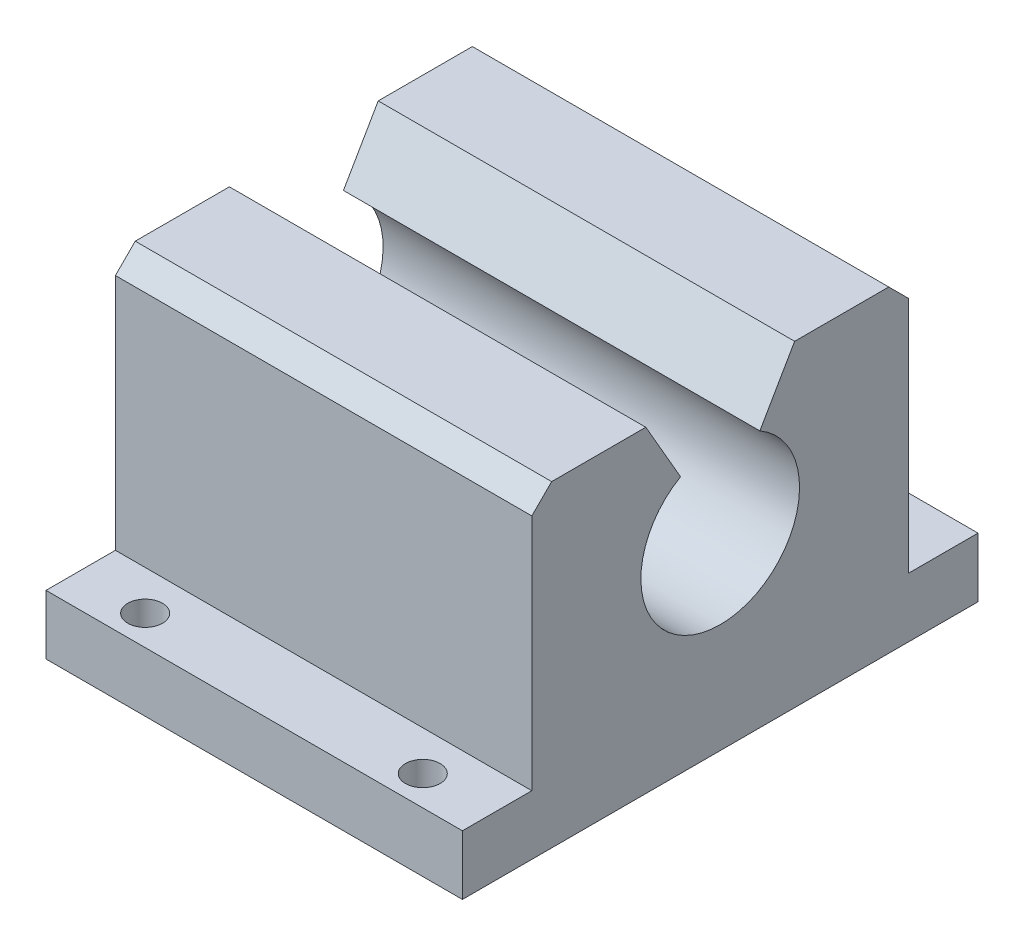
ISO-10303-21;
HEADER;
FILE_DESCRIPTION(('STEP AP214'),'2;1');
FILE_NAME('part.step','',(''),(''),'','','');
FILE_SCHEMA(('AUTOMOTIVE_DESIGN { 1 0 10303 214 1 1 1 1 }'));
ENDSEC;
DATA;
#1=APPLICATION_CONTEXT('core data for automotive mechanical design processes');
#2=APPLICATION_PROTOCOL_DEFINITION('international standard','automotive_design',2000,#1);
#3=PRODUCT_CONTEXT('',#1,'mechanical');
#4=PRODUCT('Part','Part','',(#3));
#5=PRODUCT_RELATED_PRODUCT_CATEGORY('part','',(#4));
#6=PRODUCT_DEFINITION_FORMATION('','',#4);
#7=PRODUCT_DEFINITION_CONTEXT('part definition',#1,'design');
#8=PRODUCT_DEFINITION('design','',#6,#7);
#9=PRODUCT_DEFINITION_SHAPE('','',#8);
#10=(LENGTH_UNIT() NAMED_UNIT(*) SI_UNIT(.MILLI.,.METRE.));
#11=(NAMED_UNIT(*) PLANE_ANGLE_UNIT() SI_UNIT($,.RADIAN.));
#12=(NAMED_UNIT(*) SI_UNIT($,.STERADIAN.) SOLID_ANGLE_UNIT());
#13=UNCERTAINTY_MEASURE_WITH_UNIT(LENGTH_MEASURE(1.E-05),#10,'distance_accuracy_value','');
#14=(GEOMETRIC_REPRESENTATION_CONTEXT(3) GLOBAL_UNCERTAINTY_ASSIGNED_CONTEXT((#13)) GLOBAL_UNIT_ASSIGNED_CONTEXT((#10,
#11,#12)) REPRESENTATION_CONTEXT('',''));
#15=CARTESIAN_POINT('',(0.,0.,0.));
#16=DIRECTION('',(0.,0.,1.));
#17=DIRECTION('',(1.,0.,0.));
#18=AXIS2_PLACEMENT_3D('',#15,#16,#17);
#19=CARTESIAN_POINT('',(66.675,50.8,30.1625));
#20=DIRECTION('',(0.,1.,0.));
#21=DIRECTION('',(0.,0.,1.));
#22=AXIS2_PLACEMENT_3D('',#19,#20,#21);
#23=PLANE('',#22);
#24=DIRECTION('',(0.,0.,-1.));
#25=VECTOR('',#24,1.);
#26=CARTESIAN_POINT('',(66.675,50.8,30.1625));
#27=LINE('',#26,#25);
#28=CARTESIAN_POINT('',(66.675,50.8,-11.9150661804009));
#29=VERTEX_POINT('',#28);
#30=CARTESIAN_POINT('',(66.675,50.8,-26.9874999999999));
#31=VERTEX_POINT('',#30);
#32=EDGE_CURVE('E273',#29,#31,#27,.T.);
#33=ORIENTED_EDGE('',*,*,#32,.T.);
#34=DIRECTION('',(-1.,0.,0.));
#35=VECTOR('',#34,1.);
#36=CARTESIAN_POINT('',(0.,50.8,-26.9874999999999));
#37=LINE('',#36,#35);
#38=CARTESIAN_POINT('',(0.,50.8,-26.9874999999999));
#39=VERTEX_POINT('',#38);
#40=EDGE_CURVE('E42',#31,#39,#37,.T.);
#41=ORIENTED_EDGE('',*,*,#40,.T.);
#42=DIRECTION('',(0.,0.,-1.));
#43=VECTOR('',#42,1.);
#44=CARTESIAN_POINT('',(0.,50.8,30.1625));
#45=LINE('',#44,#43);
#46=CARTESIAN_POINT('',(0.,50.8,-11.9150661804009));
#47=VERTEX_POINT('',#46);
#48=EDGE_CURVE('E151',#47,#39,#45,.T.);
#49=ORIENTED_EDGE('',*,*,#48,.F.);
#50=DIRECTION('',(1.,0.,0.));
#51=VECTOR('',#50,1.);
#52=CARTESIAN_POINT('',(0.,50.8,-11.9150661804009));
#53=LINE('',#52,#51);
#54=EDGE_CURVE('E135',#47,#29,#53,.T.);
#55=ORIENTED_EDGE('',*,*,#54,.T.);
#56=EDGE_LOOP('',(#33,#41,#49,#55));
#57=FACE_BOUND('',#56,.T.);
#58=ADVANCED_FACE('F34',(#57),#23,.T.);
#59=CARTESIAN_POINT('',(66.675,50.8,-41.275));
#60=DIRECTION('',(-1.,0.,0.));
#61=DIRECTION('',(0.,0.,1.));
#62=AXIS2_PLACEMENT_3D('',#59,#60,#61);
#63=PLANE('',#62);
#64=CARTESIAN_POINT('',(66.675,50.8,26.9875));
#65=VERTEX_POINT('',#64);
#66=CARTESIAN_POINT('',(66.675,50.8,11.9150661804009));
#67=VERTEX_POINT('',#66);
#68=EDGE_CURVE('E217',#65,#67,#27,.T.);
#69=ORIENTED_EDGE('',*,*,#68,.F.);
#70=DIRECTION('',(0.,0.707106781186551,-0.707106781186544));
#71=VECTOR('',#70,1.);
#72=CARTESIAN_POINT('',(66.675,47.6249999999999,30.1625));
#73=LINE('',#72,#71);
#74=CARTESIAN_POINT('',(66.675,47.6249999999999,30.1625));
#75=VERTEX_POINT('',#74);
#76=EDGE_CURVE('E207',#65,#75,#73,.F.);
#77=ORIENTED_EDGE('',*,*,#76,.T.);
#78=DIRECTION('',(0.,1.,0.));
#79=VECTOR('',#78,1.);
#80=CARTESIAN_POINT('',(66.675,9.525,30.1625));
#81=LINE('',#80,#79);
#82=CARTESIAN_POINT('',(66.675,9.525,30.1625));
#83=VERTEX_POINT('',#82);
#84=EDGE_CURVE('E214',#83,#75,#81,.T.);
#85=ORIENTED_EDGE('',*,*,#84,.F.);
#86=DIRECTION('',(0.,0.,-1.));
#87=VECTOR('',#86,1.);
#88=CARTESIAN_POINT('',(66.675,9.525,41.275));
#89=LINE('',#88,#87);
#90=CARTESIAN_POINT('',(66.675,9.525,41.275));
#91=VERTEX_POINT('',#90);
#92=EDGE_CURVE('E224',#91,#83,#89,.T.);
#93=ORIENTED_EDGE('',*,*,#92,.F.);
#94=DIRECTION('',(0.,1.,0.));
#95=VECTOR('',#94,1.);
#96=CARTESIAN_POINT('',(66.675,0.,41.275));
#97=LINE('',#96,#95);
#98=CARTESIAN_POINT('',(66.675,0.,41.275));
#99=VERTEX_POINT('',#98);
#100=EDGE_CURVE('E276',#99,#91,#97,.T.);
#101=ORIENTED_EDGE('',*,*,#100,.F.);
#102=DIRECTION('',(0.,0.,-1.));
#103=VECTOR('',#102,1.);
#104=CARTESIAN_POINT('',(66.675,0.,41.275));
#105=LINE('',#104,#103);
#106=CARTESIAN_POINT('',(66.675,0.,-41.275));
#107=VERTEX_POINT('',#106);
#108=EDGE_CURVE('E181',#99,#107,#105,.T.);
#109=ORIENTED_EDGE('',*,*,#108,.T.);
#110=DIRECTION('',(0.,1.,0.));
#111=VECTOR('',#110,1.);
#112=CARTESIAN_POINT('',(66.675,0.,-41.275));
#113=LINE('',#112,#111);
#114=CARTESIAN_POINT('',(66.675,9.525,-41.275));
#115=VERTEX_POINT('',#114);
#116=EDGE_CURVE('E176',#107,#115,#113,.T.);
#117=ORIENTED_EDGE('',*,*,#116,.T.);
#118=DIRECTION('',(0.,0.,1.));
#119=VECTOR('',#118,1.);
#120=CARTESIAN_POINT('',(66.675,9.525,-41.275));
#121=LINE('',#120,#119);
#122=CARTESIAN_POINT('',(66.675,9.525,-30.1625));
#123=VERTEX_POINT('',#122);
#124=EDGE_CURVE('E269',#115,#123,#121,.T.);
#125=ORIENTED_EDGE('',*,*,#124,.T.);
#126=DIRECTION('',(0.,1.,0.));
#127=VECTOR('',#126,1.);
#128=CARTESIAN_POINT('',(66.675,9.525,-30.1625));
#129=LINE('',#128,#127);
#130=CARTESIAN_POINT('',(66.675,47.625,-30.1625));
#131=VERTEX_POINT('',#130);
#132=EDGE_CURVE('E271',#123,#131,#129,.T.);
#133=ORIENTED_EDGE('',*,*,#132,.T.);
#134=DIRECTION('',(0.,0.707106781186545,0.707106781186551));
#135=VECTOR('',#134,1.);
#136=CARTESIAN_POINT('',(66.675,50.8,-26.9874999999999));
#137=LINE('',#136,#135);
#138=EDGE_CURVE('E49',#131,#31,#137,.T.);
#139=ORIENTED_EDGE('',*,*,#138,.T.);
#140=ORIENTED_EDGE('',*,*,#32,.F.);
#141=DIRECTION('',(0.,-0.866025403784438,0.500000000000001));
#142=VECTOR('',#141,1.);
#143=CARTESIAN_POINT('',(66.675,50.8,-11.9150661804009));
#144=LINE('',#143,#142);
#145=CARTESIAN_POINT('',(66.675,41.1610226280624,-6.35000000000001));
#146=VERTEX_POINT('',#145);
#147=EDGE_CURVE('E141',#29,#146,#144,.T.);
#148=ORIENTED_EDGE('',*,*,#147,.T.);
#149=CARTESIAN_POINT('',(66.675,30.1625,0.));
#150=DIRECTION('',(1.,0.,0.));
#151=DIRECTION('',(0.,0.,-1.));
#152=AXIS2_PLACEMENT_3D('',#149,#150,#151);
#153=CIRCLE('',#152,12.7);
#154=CARTESIAN_POINT('',(66.675,41.1610226280624,6.35000000000001));
#155=VERTEX_POINT('',#154);
#156=EDGE_CURVE('E262',#155,#146,#153,.T.);
#157=ORIENTED_EDGE('',*,*,#156,.F.);
#158=DIRECTION('',(0.,-0.866025403784438,-0.500000000000001));
#159=VECTOR('',#158,1.);
#160=CARTESIAN_POINT('',(66.675,50.8,11.9150661804009));
#161=LINE('',#160,#159);
#162=EDGE_CURVE('E482',#67,#155,#161,.T.);
#163=ORIENTED_EDGE('',*,*,#162,.F.);
#164=EDGE_LOOP('',(#69,#77,#85,#93,#101,#109,#117,#125,#133,#139,#140,#148,#157,#163));
#165=FACE_BOUND('',#164,.T.);
#166=ADVANCED_FACE('F212',(#165),#63,.F.);
#167=CARTESIAN_POINT('',(0.,50.8,-41.275));
#168=DIRECTION('',(-1.,0.,0.));
#169=DIRECTION('',(0.,0.,1.));
#170=AXIS2_PLACEMENT_3D('',#167,#168,#169);
#171=PLANE('',#170);
#172=DIRECTION('',(0.,1.,0.));
#173=VECTOR('',#172,1.);
#174=CARTESIAN_POINT('',(0.,9.525,30.1625));
#175=LINE('',#174,#173);
#176=CARTESIAN_POINT('',(0.,9.525,30.1625));
#177=VERTEX_POINT('',#176);
#178=CARTESIAN_POINT('',(0.,47.6249999999999,30.1625));
#179=VERTEX_POINT('',#178);
#180=EDGE_CURVE('E162',#177,#179,#175,.T.);
#181=ORIENTED_EDGE('',*,*,#180,.T.);
#182=DIRECTION('',(0.,-0.707106781186551,0.707106781186544));
#183=VECTOR('',#182,1.);
#184=CARTESIAN_POINT('',(0.,84.93125,-7.14374999999968));
#185=LINE('',#184,#183);
#186=CARTESIAN_POINT('',(0.,50.8,26.9875));
#187=VERTEX_POINT('',#186);
#188=EDGE_CURVE('E202',#179,#187,#185,.F.);
#189=ORIENTED_EDGE('',*,*,#188,.T.);
#190=CARTESIAN_POINT('',(0.,50.8,11.9150661804009));
#191=VERTEX_POINT('',#190);
#192=EDGE_CURVE('E159',#187,#191,#45,.T.);
#193=ORIENTED_EDGE('',*,*,#192,.T.);
#194=DIRECTION('',(0.,-0.866025403784438,-0.500000000000001));
#195=VECTOR('',#194,1.);
#196=CARTESIAN_POINT('',(0.,50.8,11.9150661804009));
#197=LINE('',#196,#195);
#198=CARTESIAN_POINT('',(0.,41.1610226280624,6.35000000000001));
#199=VERTEX_POINT('',#198);
#200=EDGE_CURVE('E155',#191,#199,#197,.T.);
#201=ORIENTED_EDGE('',*,*,#200,.T.);
#202=CARTESIAN_POINT('',(0.,30.1625,0.));
#203=DIRECTION('',(1.,0.,0.));
#204=DIRECTION('',(0.,0.,-1.));
#205=AXIS2_PLACEMENT_3D('',#202,#203,#204);
#206=CIRCLE('',#205,12.7);
#207=CARTESIAN_POINT('',(0.,41.1610226280624,-6.35000000000001));
#208=VERTEX_POINT('',#207);
#209=EDGE_CURVE('E154',#199,#208,#206,.T.);
#210=ORIENTED_EDGE('',*,*,#209,.T.);
#211=DIRECTION('',(0.,-0.866025403784438,0.500000000000001));
#212=VECTOR('',#211,1.);
#213=CARTESIAN_POINT('',(0.,50.8,-11.9150661804009));
#214=LINE('',#213,#212);
#215=EDGE_CURVE('E138',#47,#208,#214,.T.);
#216=ORIENTED_EDGE('',*,*,#215,.F.);
#217=ORIENTED_EDGE('',*,*,#48,.T.);
#218=DIRECTION('',(0.,-0.707106781186545,-0.707106781186551));
#219=VECTOR('',#218,1.);
#220=CARTESIAN_POINT('',(0.,43.65625,-34.13125));
#221=LINE('',#220,#219);
#222=CARTESIAN_POINT('',(0.,47.625,-30.1625));
#223=VERTEX_POINT('',#222);
#224=EDGE_CURVE('E200',#39,#223,#221,.T.);
#225=ORIENTED_EDGE('',*,*,#224,.T.);
#226=DIRECTION('',(0.,1.,0.));
#227=VECTOR('',#226,1.);
#228=CARTESIAN_POINT('',(0.,9.525,-30.1625));
#229=LINE('',#228,#227);
#230=CARTESIAN_POINT('',(0.,9.525,-30.1625));
#231=VERTEX_POINT('',#230);
#232=EDGE_CURVE('E160',#231,#223,#229,.T.);
#233=ORIENTED_EDGE('',*,*,#232,.F.);
#234=DIRECTION('',(0.,0.,1.));
#235=VECTOR('',#234,1.);
#236=CARTESIAN_POINT('',(0.,9.525,-41.275));
#237=LINE('',#236,#235);
#238=CARTESIAN_POINT('',(0.,9.525,-41.275));
#239=VERTEX_POINT('',#238);
#240=EDGE_CURVE('E163',#239,#231,#237,.T.);
#241=ORIENTED_EDGE('',*,*,#240,.F.);
#242=DIRECTION('',(0.,1.,0.));
#243=VECTOR('',#242,1.);
#244=CARTESIAN_POINT('',(0.,0.,-41.275));
#245=LINE('',#244,#243);
#246=CARTESIAN_POINT('',(0.,0.,-41.275));
#247=VERTEX_POINT('',#246);
#248=EDGE_CURVE('E265',#247,#239,#245,.T.);
#249=ORIENTED_EDGE('',*,*,#248,.F.);
#250=DIRECTION('',(0.,0.,-1.));
#251=VECTOR('',#250,1.);
#252=CARTESIAN_POINT('',(0.,0.,41.275));
#253=LINE('',#252,#251);
#254=CARTESIAN_POINT('',(0.,0.,41.275));
#255=VERTEX_POINT('',#254);
#256=EDGE_CURVE('E174',#255,#247,#253,.T.);
#257=ORIENTED_EDGE('',*,*,#256,.F.);
#258=DIRECTION('',(0.,1.,0.));
#259=VECTOR('',#258,1.);
#260=CARTESIAN_POINT('',(0.,0.,41.275));
#261=LINE('',#260,#259);
#262=CARTESIAN_POINT('',(0.,9.525,41.275));
#263=VERTEX_POINT('',#262);
#264=EDGE_CURVE('E171',#255,#263,#261,.T.);
#265=ORIENTED_EDGE('',*,*,#264,.T.);
#266=DIRECTION('',(0.,0.,-1.));
#267=VECTOR('',#266,1.);
#268=CARTESIAN_POINT('',(0.,9.525,41.275));
#269=LINE('',#268,#267);
#270=EDGE_CURVE('E168',#263,#177,#269,.T.);
#271=ORIENTED_EDGE('',*,*,#270,.T.);
#272=EDGE_LOOP('',(#181,#189,#193,#201,#210,#216,#217,#225,#233,#241,#249,#257,#265,#271));
#273=FACE_BOUND('',#272,.T.);
#274=ADVANCED_FACE('F150',(#273),#171,.T.);
#275=CARTESIAN_POINT('',(66.675,0.,-41.275));
#276=DIRECTION('',(0.,0.,1.));
#277=DIRECTION('',(1.,0.,0.));
#278=AXIS2_PLACEMENT_3D('',#275,#276,#277);
#279=PLANE('',#278);
#280=ORIENTED_EDGE('',*,*,#248,.T.);
#281=DIRECTION('',(-1.,0.,0.));
#282=VECTOR('',#281,1.);
#283=CARTESIAN_POINT('',(66.675,9.525,-41.275));
#284=LINE('',#283,#282);
#285=EDGE_CURVE('E190',#115,#239,#284,.T.);
#286=ORIENTED_EDGE('',*,*,#285,.F.);
#287=ORIENTED_EDGE('',*,*,#116,.F.);
#288=DIRECTION('',(-1.,0.,0.));
#289=VECTOR('',#288,1.);
#290=CARTESIAN_POINT('',(66.675,0.,-41.275));
#291=LINE('',#290,#289);
#292=EDGE_CURVE('E177',#107,#247,#291,.T.);
#293=ORIENTED_EDGE('',*,*,#292,.T.);
#294=EDGE_LOOP('',(#280,#286,#287,#293));
#295=FACE_BOUND('',#294,.T.);
#296=ADVANCED_FACE('F311',(#295),#279,.F.);
#297=CARTESIAN_POINT('',(66.675,9.525,-41.275));
#298=DIRECTION('',(0.,-1.,0.));
#299=DIRECTION('',(0.,0.,-1.));
#300=AXIS2_PLACEMENT_3D('',#297,#298,#299);
#301=PLANE('',#300);
#302=CARTESIAN_POINT('',(11.1125,9.525,-36.5125));
#303=DIRECTION('',(0.,1.,0.));
#304=DIRECTION('',(0.,0.,1.));
#305=AXIS2_PLACEMENT_3D('',#302,#303,#304);
#306=CIRCLE('',#305,2.778125);
#307=CARTESIAN_POINT('',(11.1125,9.525,-33.734375));
#308=VERTEX_POINT('',#307);
#309=EDGE_CURVE('E234',#308,#308,#306,.T.);
#310=ORIENTED_EDGE('',*,*,#309,.F.);
#311=EDGE_LOOP('',(#310));
#312=FACE_BOUND('',#311,.T.);
#313=CARTESIAN_POINT('',(55.5625,9.525,-36.5125));
#314=DIRECTION('',(0.,1.,0.));
#315=DIRECTION('',(0.,0.,1.));
#316=AXIS2_PLACEMENT_3D('',#313,#314,#315);
#317=CIRCLE('',#316,2.778125);
#318=CARTESIAN_POINT('',(55.5625,9.525,-33.734375));
#319=VERTEX_POINT('',#318);
#320=EDGE_CURVE('E248',#319,#319,#317,.T.);
#321=ORIENTED_EDGE('',*,*,#320,.F.);
#322=EDGE_LOOP('',(#321));
#323=FACE_BOUND('',#322,.T.);
#324=ORIENTED_EDGE('',*,*,#240,.T.);
#325=DIRECTION('',(-1.,0.,0.));
#326=VECTOR('',#325,1.);
#327=CARTESIAN_POINT('',(66.675,9.525,-30.1625));
#328=LINE('',#327,#326);
#329=EDGE_CURVE('E187',#123,#231,#328,.T.);
#330=ORIENTED_EDGE('',*,*,#329,.F.);
#331=ORIENTED_EDGE('',*,*,#124,.F.);
#332=ORIENTED_EDGE('',*,*,#285,.T.);
#333=EDGE_LOOP('',(#324,#330,#331,#332));
#334=FACE_BOUND('',#333,.T.);
#335=ADVANCED_FACE('F283',(#312,#323,#334),#301,.F.);
#336=CARTESIAN_POINT('',(66.675,9.525,-30.1625));
#337=DIRECTION('',(0.,0.,1.));
#338=DIRECTION('',(1.,0.,0.));
#339=AXIS2_PLACEMENT_3D('',#336,#337,#338);
#340=PLANE('',#339);
#341=ORIENTED_EDGE('',*,*,#232,.T.);
#342=DIRECTION('',(1.,0.,0.));
#343=VECTOR('',#342,1.);
#344=CARTESIAN_POINT('',(66.675,47.625,-30.1625));
#345=LINE('',#344,#343);
#346=EDGE_CURVE('E11',#223,#131,#345,.T.);
#347=ORIENTED_EDGE('',*,*,#346,.T.);
#348=ORIENTED_EDGE('',*,*,#132,.F.);
#349=ORIENTED_EDGE('',*,*,#329,.T.);
#350=EDGE_LOOP('',(#341,#347,#348,#349));
#351=FACE_BOUND('',#350,.T.);
#352=ADVANCED_FACE('F287',(#351),#340,.F.);
#353=ORIENTED_EDGE('',*,*,#192,.F.);
#354=DIRECTION('',(1.,0.,0.));
#355=VECTOR('',#354,1.);
#356=CARTESIAN_POINT('',(66.675,50.8,26.9875));
#357=LINE('',#356,#355);
#358=EDGE_CURVE('E204',#187,#65,#357,.T.);
#359=ORIENTED_EDGE('',*,*,#358,.T.);
#360=ORIENTED_EDGE('',*,*,#68,.T.);
#361=DIRECTION('',(1.,0.,0.));
#362=VECTOR('',#361,1.);
#363=CARTESIAN_POINT('',(0.,50.8,11.9150661804009));
#364=LINE('',#363,#362);
#365=EDGE_CURVE('E144',#191,#67,#364,.T.);
#366=ORIENTED_EDGE('',*,*,#365,.F.);
#367=EDGE_LOOP('',(#353,#359,#360,#366));
#368=FACE_BOUND('',#367,.T.);
#369=ADVANCED_FACE('F231',(#368),#23,.T.);
#370=CARTESIAN_POINT('',(66.675,9.525,30.1625));
#371=DIRECTION('',(0.,0.,1.));
#372=DIRECTION('',(1.,0.,0.));
#373=AXIS2_PLACEMENT_3D('',#370,#371,#372);
#374=PLANE('',#373);
#375=ORIENTED_EDGE('',*,*,#84,.T.);
#376=DIRECTION('',(-1.,0.,0.));
#377=VECTOR('',#376,1.);
#378=CARTESIAN_POINT('',(66.675,47.6249999999999,30.1625));
#379=LINE('',#378,#377);
#380=EDGE_CURVE('E197',#75,#179,#379,.T.);
#381=ORIENTED_EDGE('',*,*,#380,.T.);
#382=ORIENTED_EDGE('',*,*,#180,.F.);
#383=DIRECTION('',(-1.,0.,0.));
#384=VECTOR('',#383,1.);
#385=CARTESIAN_POINT('',(66.675,9.525,30.1625));
#386=LINE('',#385,#384);
#387=EDGE_CURVE('E185',#83,#177,#386,.T.);
#388=ORIENTED_EDGE('',*,*,#387,.F.);
#389=EDGE_LOOP('',(#375,#381,#382,#388));
#390=FACE_BOUND('',#389,.T.);
#391=ADVANCED_FACE('F222',(#390),#374,.T.);
#392=CARTESIAN_POINT('',(66.675,9.525,41.275));
#393=DIRECTION('',(0.,1.,0.));
#394=DIRECTION('',(0.,0.,1.));
#395=AXIS2_PLACEMENT_3D('',#392,#393,#394);
#396=PLANE('',#395);
#397=CARTESIAN_POINT('',(11.1125,9.525,36.5125));
#398=DIRECTION('',(0.,1.,0.));
#399=DIRECTION('',(0.,0.,1.));
#400=AXIS2_PLACEMENT_3D('',#397,#398,#399);
#401=CIRCLE('',#400,2.778125);
#402=CARTESIAN_POINT('',(11.1125,9.525,39.290625));
#403=VERTEX_POINT('',#402);
#404=EDGE_CURVE('E243',#403,#403,#401,.T.);
#405=ORIENTED_EDGE('',*,*,#404,.F.);
#406=EDGE_LOOP('',(#405));
#407=FACE_BOUND('',#406,.T.);
#408=CARTESIAN_POINT('',(55.5625,9.525,36.5125));
#409=DIRECTION('',(0.,1.,0.));
#410=DIRECTION('',(0.,0.,1.));
#411=AXIS2_PLACEMENT_3D('',#408,#409,#410);
#412=CIRCLE('',#411,2.778125);
#413=CARTESIAN_POINT('',(55.5625,9.525,39.290625));
#414=VERTEX_POINT('',#413);
#415=EDGE_CURVE('E254',#414,#414,#412,.T.);
#416=ORIENTED_EDGE('',*,*,#415,.F.);
#417=EDGE_LOOP('',(#416));
#418=FACE_BOUND('',#417,.T.);
#419=ORIENTED_EDGE('',*,*,#270,.F.);
#420=DIRECTION('',(-1.,0.,0.));
#421=VECTOR('',#420,1.);
#422=CARTESIAN_POINT('',(66.675,9.525,41.275));
#423=LINE('',#422,#421);
#424=EDGE_CURVE('E183',#91,#263,#423,.T.);
#425=ORIENTED_EDGE('',*,*,#424,.F.);
#426=ORIENTED_EDGE('',*,*,#92,.T.);
#427=ORIENTED_EDGE('',*,*,#387,.T.);
#428=EDGE_LOOP('',(#419,#425,#426,#427));
#429=FACE_BOUND('',#428,.T.);
#430=ADVANCED_FACE('F307',(#407,#418,#429),#396,.T.);
#431=CARTESIAN_POINT('',(66.675,0.,41.275));
#432=DIRECTION('',(0.,0.,1.));
#433=DIRECTION('',(1.,0.,0.));
#434=AXIS2_PLACEMENT_3D('',#431,#432,#433);
#435=PLANE('',#434);
#436=ORIENTED_EDGE('',*,*,#264,.F.);
#437=DIRECTION('',(-1.,0.,0.));
#438=VECTOR('',#437,1.);
#439=CARTESIAN_POINT('',(66.675,0.,41.275));
#440=LINE('',#439,#438);
#441=EDGE_CURVE('E180',#99,#255,#440,.T.);
#442=ORIENTED_EDGE('',*,*,#441,.F.);
#443=ORIENTED_EDGE('',*,*,#100,.T.);
#444=ORIENTED_EDGE('',*,*,#424,.T.);
#445=EDGE_LOOP('',(#436,#442,#443,#444));
#446=FACE_BOUND('',#445,.T.);
#447=ADVANCED_FACE('F327',(#446),#435,.T.);
#448=CARTESIAN_POINT('',(66.675,0.,41.275));
#449=DIRECTION('',(0.,1.,0.));
#450=DIRECTION('',(0.,0.,1.));
#451=AXIS2_PLACEMENT_3D('',#448,#449,#450);
#452=PLANE('',#451);
#453=CARTESIAN_POINT('',(11.1125,0.,-36.5125));
#454=DIRECTION('',(0.,1.,0.));
#455=DIRECTION('',(0.,0.,1.));
#456=AXIS2_PLACEMENT_3D('',#453,#454,#455);
#457=CIRCLE('',#456,2.778125);
#458=CARTESIAN_POINT('',(11.1125,0.,-33.734375));
#459=VERTEX_POINT('',#458);
#460=EDGE_CURVE('E237',#459,#459,#457,.T.);
#461=ORIENTED_EDGE('',*,*,#460,.T.);
#462=EDGE_LOOP('',(#461));
#463=FACE_BOUND('',#462,.T.);
#464=CARTESIAN_POINT('',(11.1125,0.,36.5125));
#465=DIRECTION('',(0.,1.,0.));
#466=DIRECTION('',(0.,0.,1.));
#467=AXIS2_PLACEMENT_3D('',#464,#465,#466);
#468=CIRCLE('',#467,2.778125);
#469=CARTESIAN_POINT('',(11.1125,0.,39.290625));
#470=VERTEX_POINT('',#469);
#471=EDGE_CURVE('E245',#470,#470,#468,.T.);
#472=ORIENTED_EDGE('',*,*,#471,.T.);
#473=EDGE_LOOP('',(#472));
#474=FACE_BOUND('',#473,.T.);
#475=CARTESIAN_POINT('',(55.5625,0.,-36.5125));
#476=DIRECTION('',(0.,1.,0.));
#477=DIRECTION('',(0.,0.,1.));
#478=AXIS2_PLACEMENT_3D('',#475,#476,#477);
#479=CIRCLE('',#478,2.778125);
#480=CARTESIAN_POINT('',(55.5625,0.,-33.734375));
#481=VERTEX_POINT('',#480);
#482=EDGE_CURVE('E251',#481,#481,#479,.T.);
#483=ORIENTED_EDGE('',*,*,#482,.T.);
#484=EDGE_LOOP('',(#483));
#485=FACE_BOUND('',#484,.T.);
#486=CARTESIAN_POINT('',(55.5625,0.,36.5125));
#487=DIRECTION('',(0.,1.,0.));
#488=DIRECTION('',(0.,0.,1.));
#489=AXIS2_PLACEMENT_3D('',#486,#487,#488);
#490=CIRCLE('',#489,2.778125);
#491=CARTESIAN_POINT('',(55.5625,0.,39.290625));
#492=VERTEX_POINT('',#491);
#493=EDGE_CURVE('E257',#492,#492,#490,.T.);
#494=ORIENTED_EDGE('',*,*,#493,.T.);
#495=EDGE_LOOP('',(#494));
#496=FACE_BOUND('',#495,.T.);
#497=ORIENTED_EDGE('',*,*,#256,.T.);
#498=ORIENTED_EDGE('',*,*,#292,.F.);
#499=ORIENTED_EDGE('',*,*,#108,.F.);
#500=ORIENTED_EDGE('',*,*,#441,.T.);
#501=EDGE_LOOP('',(#497,#498,#499,#500));
#502=FACE_BOUND('',#501,.T.);
#503=ADVANCED_FACE('F332',(#463,#474,#485,#496,#502),#452,.F.);
#504=CARTESIAN_POINT('',(66.675,30.1625,0.));
#505=DIRECTION('',(-1.,0.,0.));
#506=DIRECTION('',(0.,0.,1.));
#507=AXIS2_PLACEMENT_3D('',#504,#505,#506);
#508=CYLINDRICAL_SURFACE('',#507,12.7);
#509=DIRECTION('',(-1.,0.,0.));
#510=VECTOR('',#509,1.);
#511=CARTESIAN_POINT('',(66.675,41.1610226280624,6.35000000000001));
#512=LINE('',#511,#510);
#513=EDGE_CURVE('E195',#155,#199,#512,.T.);
#514=ORIENTED_EDGE('',*,*,#513,.F.);
#515=ORIENTED_EDGE('',*,*,#156,.T.);
#516=DIRECTION('',(-1.,0.,0.));
#517=VECTOR('',#516,1.);
#518=CARTESIAN_POINT('',(66.675,41.1610226280624,-6.35000000000001));
#519=LINE('',#518,#517);
#520=EDGE_CURVE('E193',#146,#208,#519,.T.);
#521=ORIENTED_EDGE('',*,*,#520,.T.);
#522=ORIENTED_EDGE('',*,*,#209,.F.);
#523=EDGE_LOOP('',(#514,#515,#521,#522));
#524=FACE_BOUND('',#523,.T.);
#525=ADVANCED_FACE('F334',(#524),#508,.F.);
#526=CARTESIAN_POINT('',(55.5625,0.,36.5125));
#527=DIRECTION('',(0.,1.,0.));
#528=DIRECTION('',(0.,0.,1.));
#529=AXIS2_PLACEMENT_3D('',#526,#527,#528);
#530=CYLINDRICAL_SURFACE('',#529,2.778125);
#531=ORIENTED_EDGE('',*,*,#493,.F.);
#532=EDGE_LOOP('',(#531));
#533=FACE_BOUND('',#532,.T.);
#534=ORIENTED_EDGE('',*,*,#415,.T.);
#535=EDGE_LOOP('',(#534));
#536=FACE_BOUND('',#535,.T.);
#537=ADVANCED_FACE('F341',(#533,#536),#530,.F.);
#538=CARTESIAN_POINT('',(55.5625,0.,-36.5125));
#539=DIRECTION('',(0.,1.,0.));
#540=DIRECTION('',(0.,0.,1.));
#541=AXIS2_PLACEMENT_3D('',#538,#539,#540);
#542=CYLINDRICAL_SURFACE('',#541,2.778125);
#543=ORIENTED_EDGE('',*,*,#482,.F.);
#544=EDGE_LOOP('',(#543));
#545=FACE_BOUND('',#544,.T.);
#546=ORIENTED_EDGE('',*,*,#320,.T.);
#547=EDGE_LOOP('',(#546));
#548=FACE_BOUND('',#547,.T.);
#549=ADVANCED_FACE('F356',(#545,#548),#542,.F.);
#550=CARTESIAN_POINT('',(11.1125,0.,36.5125));
#551=DIRECTION('',(0.,1.,0.));
#552=DIRECTION('',(0.,0.,1.));
#553=AXIS2_PLACEMENT_3D('',#550,#551,#552);
#554=CYLINDRICAL_SURFACE('',#553,2.778125);
#555=ORIENTED_EDGE('',*,*,#471,.F.);
#556=EDGE_LOOP('',(#555));
#557=FACE_BOUND('',#556,.T.);
#558=ORIENTED_EDGE('',*,*,#404,.T.);
#559=EDGE_LOOP('',(#558));
#560=FACE_BOUND('',#559,.T.);
#561=ADVANCED_FACE('F362',(#557,#560),#554,.F.);
#562=CARTESIAN_POINT('',(11.1125,0.,-36.5125));
#563=DIRECTION('',(0.,1.,0.));
#564=DIRECTION('',(0.,0.,1.));
#565=AXIS2_PLACEMENT_3D('',#562,#563,#564);
#566=CYLINDRICAL_SURFACE('',#565,2.778125);
#567=ORIENTED_EDGE('',*,*,#460,.F.);
#568=EDGE_LOOP('',(#567));
#569=FACE_BOUND('',#568,.T.);
#570=ORIENTED_EDGE('',*,*,#309,.T.);
#571=EDGE_LOOP('',(#570));
#572=FACE_BOUND('',#571,.T.);
#573=ADVANCED_FACE('F369',(#569,#572),#566,.F.);
#574=CARTESIAN_POINT('',(0.,50.8,-11.9150661804009));
#575=DIRECTION('',(0.,0.500000000000001,0.866025403784438));
#576=DIRECTION('',(0.,-0.866025403784438,0.500000000000001));
#577=AXIS2_PLACEMENT_3D('',#574,#575,#576);
#578=PLANE('',#577);
#579=ORIENTED_EDGE('',*,*,#147,.F.);
#580=ORIENTED_EDGE('',*,*,#54,.F.);
#581=ORIENTED_EDGE('',*,*,#215,.T.);
#582=ORIENTED_EDGE('',*,*,#520,.F.);
#583=EDGE_LOOP('',(#579,#580,#581,#582));
#584=FACE_BOUND('',#583,.T.);
#585=ADVANCED_FACE('F137',(#584),#578,.T.);
#586=CARTESIAN_POINT('',(0.,50.8,11.9150661804009));
#587=DIRECTION('',(0.,-0.500000000000001,0.866025403784438));
#588=DIRECTION('',(0.,-0.866025403784438,-0.500000000000001));
#589=AXIS2_PLACEMENT_3D('',#586,#587,#588);
#590=PLANE('',#589);
#591=ORIENTED_EDGE('',*,*,#513,.T.);
#592=ORIENTED_EDGE('',*,*,#200,.F.);
#593=ORIENTED_EDGE('',*,*,#365,.T.);
#594=ORIENTED_EDGE('',*,*,#162,.T.);
#595=EDGE_LOOP('',(#591,#592,#593,#594));
#596=FACE_BOUND('',#595,.T.);
#597=ADVANCED_FACE('F293',(#596),#590,.F.);
#598=CARTESIAN_POINT('',(66.675,47.6249999999999,30.1625));
#599=DIRECTION('',(0.,-0.707106781186544,-0.707106781186551));
#600=DIRECTION('',(0.,0.707106781186551,-0.707106781186544));
#601=AXIS2_PLACEMENT_3D('',#598,#599,#600);
#602=PLANE('',#601);
#603=ORIENTED_EDGE('',*,*,#76,.F.);
#604=ORIENTED_EDGE('',*,*,#358,.F.);
#605=ORIENTED_EDGE('',*,*,#188,.F.);
#606=ORIENTED_EDGE('',*,*,#380,.F.);
#607=EDGE_LOOP('',(#603,#604,#605,#606));
#608=FACE_BOUND('',#607,.T.);
#609=ADVANCED_FACE('F226',(#608),#602,.F.);
#610=CARTESIAN_POINT('',(66.675,50.8,-26.9874999999999));
#611=DIRECTION('',(0.,0.707106781186551,-0.707106781186545));
#612=DIRECTION('',(0.,0.707106781186545,0.707106781186551));
#613=AXIS2_PLACEMENT_3D('',#610,#611,#612);
#614=PLANE('',#613);
#615=ORIENTED_EDGE('',*,*,#138,.F.);
#616=ORIENTED_EDGE('',*,*,#346,.F.);
#617=ORIENTED_EDGE('',*,*,#224,.F.);
#618=ORIENTED_EDGE('',*,*,#40,.F.);
#619=EDGE_LOOP('',(#615,#616,#617,#618));
#620=FACE_BOUND('',#619,.T.);
#621=ADVANCED_FACE('F36',(#620),#614,.T.);
#622=CLOSED_SHELL('',(#58,#166,#274,#296,#335,#352,#369,#391,#430,#447,#503,#525,#537,#549,#561,
#573,#585,#597,#609,#621));
#623=MANIFOLD_SOLID_BREP('B2',#622);
#624=ADVANCED_BREP_SHAPE_REPRESENTATION('',(#18,#623),#14);
#625=SHAPE_DEFINITION_REPRESENTATION(#9,#624);
ENDSEC;
END-ISO-10303-21;
